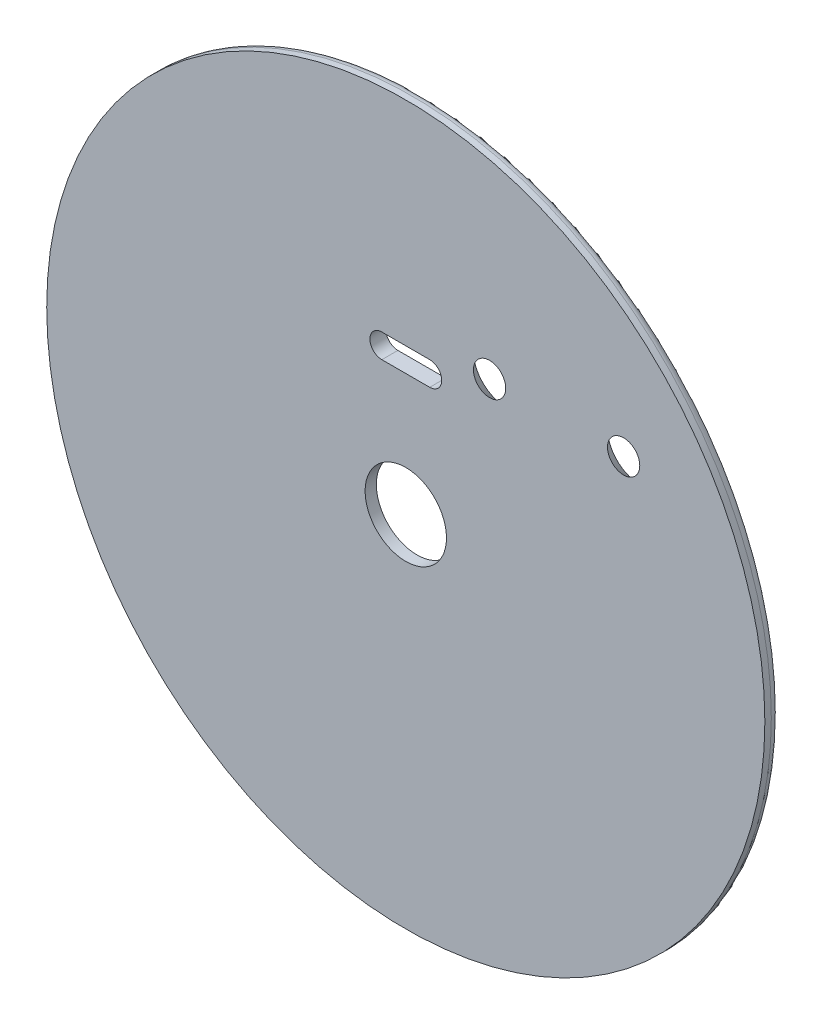
ISO-10303-21;
HEADER;
FILE_DESCRIPTION(('STEP AP214'),'2;1');
FILE_NAME('part.step','',(''),(''),'','','');
FILE_SCHEMA(('AUTOMOTIVE_DESIGN { 1 0 10303 214 1 1 1 1 }'));
ENDSEC;
DATA;
#1=APPLICATION_CONTEXT('core data for automotive mechanical design processes');
#2=APPLICATION_PROTOCOL_DEFINITION('international standard','automotive_design',2000,#1);
#3=PRODUCT_CONTEXT('',#1,'mechanical');
#4=PRODUCT('Part','Part','',(#3));
#5=PRODUCT_RELATED_PRODUCT_CATEGORY('part','',(#4));
#6=PRODUCT_DEFINITION_FORMATION('','',#4);
#7=PRODUCT_DEFINITION_CONTEXT('part definition',#1,'design');
#8=PRODUCT_DEFINITION('design','',#6,#7);
#9=PRODUCT_DEFINITION_SHAPE('','',#8);
#10=(LENGTH_UNIT() NAMED_UNIT(*) SI_UNIT(.MILLI.,.METRE.));
#11=(NAMED_UNIT(*) PLANE_ANGLE_UNIT() SI_UNIT($,.RADIAN.));
#12=(NAMED_UNIT(*) SI_UNIT($,.STERADIAN.) SOLID_ANGLE_UNIT());
#13=UNCERTAINTY_MEASURE_WITH_UNIT(LENGTH_MEASURE(1.E-05),#10,'distance_accuracy_value','');
#14=(GEOMETRIC_REPRESENTATION_CONTEXT(3) GLOBAL_UNCERTAINTY_ASSIGNED_CONTEXT((#13)) GLOBAL_UNIT_ASSIGNED_CONTEXT((#10,
#11,#12)) REPRESENTATION_CONTEXT('',''));
#15=CARTESIAN_POINT('',(0.,0.,0.));
#16=DIRECTION('',(0.,0.,1.));
#17=DIRECTION('',(1.,0.,0.));
#18=AXIS2_PLACEMENT_3D('',#15,#16,#17);
#19=CARTESIAN_POINT('',(0.,0.,3.35));
#20=DIRECTION('',(0.,0.,-1.));
#21=DIRECTION('',(-1.,0.,0.));
#22=AXIS2_PLACEMENT_3D('',#19,#20,#21);
#23=CYLINDRICAL_SURFACE('',#22,8.5);
#24=CARTESIAN_POINT('',(0.,0.,3.35));
#25=DIRECTION('',(0.,0.,1.));
#26=DIRECTION('',(1.,0.,0.));
#27=AXIS2_PLACEMENT_3D('',#24,#25,#26);
#28=CIRCLE('',#27,8.5);
#29=CARTESIAN_POINT('',(8.5,0.,3.35));
#30=VERTEX_POINT('',#29);
#31=EDGE_CURVE('E115',#30,#30,#28,.T.);
#32=ORIENTED_EDGE('',*,*,#31,.T.);
#33=EDGE_LOOP('',(#32));
#34=FACE_BOUND('',#33,.T.);
#35=CARTESIAN_POINT('',(0.,0.,1.));
#36=DIRECTION('',(0.,0.,-1.));
#37=DIRECTION('',(-1.,0.,0.));
#38=AXIS2_PLACEMENT_3D('',#35,#36,#37);
#39=CIRCLE('',#38,8.5);
#40=CARTESIAN_POINT('',(-8.5,0.,1.));
#41=VERTEX_POINT('',#40);
#42=EDGE_CURVE('E112',#41,#41,#39,.T.);
#43=ORIENTED_EDGE('',*,*,#42,.T.);
#44=EDGE_LOOP('',(#43));
#45=FACE_BOUND('',#44,.T.);
#46=ADVANCED_FACE('F32',(#34,#45),#23,.F.);
#47=CARTESIAN_POINT('',(0.,0.,3.35));
#48=DIRECTION('',(0.,0.,1.));
#49=DIRECTION('',(1.,0.,0.));
#50=AXIS2_PLACEMENT_3D('',#47,#48,#49);
#51=PLANE('',#50);
#52=CARTESIAN_POINT('',(45.5,33.25,3.35));
#53=DIRECTION('',(0.,0.,1.));
#54=DIRECTION('',(1.,0.,0.));
#55=AXIS2_PLACEMENT_3D('',#52,#53,#54);
#56=CIRCLE('',#55,3.37000000000001);
#57=CARTESIAN_POINT('',(48.87,33.25,3.35));
#58=VERTEX_POINT('',#57);
#59=EDGE_CURVE('E199',#58,#58,#56,.T.);
#60=ORIENTED_EDGE('',*,*,#59,.F.);
#61=EDGE_LOOP('',(#60));
#62=FACE_BOUND('',#61,.T.);
#63=CARTESIAN_POINT('',(17.5,33.25,3.35));
#64=DIRECTION('',(0.,0.,1.));
#65=DIRECTION('',(1.,0.,0.));
#66=AXIS2_PLACEMENT_3D('',#63,#64,#65);
#67=CIRCLE('',#66,3.37000000000001);
#68=CARTESIAN_POINT('',(20.87,33.25,3.35));
#69=VERTEX_POINT('',#68);
#70=EDGE_CURVE('E190',#69,#69,#67,.T.);
#71=ORIENTED_EDGE('',*,*,#70,.F.);
#72=EDGE_LOOP('',(#71));
#73=FACE_BOUND('',#72,.T.);
#74=CARTESIAN_POINT('',(5.,28.,3.35));
#75=DIRECTION('',(0.,0.,1.));
#76=DIRECTION('',(1.,0.,0.));
#77=AXIS2_PLACEMENT_3D('',#74,#75,#76);
#78=CIRCLE('',#77,2.5);
#79=CARTESIAN_POINT('',(5.,25.5,3.35));
#80=VERTEX_POINT('',#79);
#81=CARTESIAN_POINT('',(5.,30.5,3.35));
#82=VERTEX_POINT('',#81);
#83=EDGE_CURVE('E106',#80,#82,#78,.T.);
#84=ORIENTED_EDGE('',*,*,#83,.F.);
#85=DIRECTION('',(1.,0.,0.));
#86=VECTOR('',#85,1.);
#87=CARTESIAN_POINT('',(0.,25.5,3.35));
#88=LINE('',#87,#86);
#89=CARTESIAN_POINT('',(-5.,25.5,3.35));
#90=VERTEX_POINT('',#89);
#91=EDGE_CURVE('E99',#90,#80,#88,.T.);
#92=ORIENTED_EDGE('',*,*,#91,.F.);
#93=CARTESIAN_POINT('',(-5.,28.,3.35));
#94=DIRECTION('',(0.,0.,1.));
#95=DIRECTION('',(1.,0.,0.));
#96=AXIS2_PLACEMENT_3D('',#93,#94,#95);
#97=CIRCLE('',#96,2.5);
#98=CARTESIAN_POINT('',(-5.,30.5,3.35));
#99=VERTEX_POINT('',#98);
#100=EDGE_CURVE('E79',#99,#90,#97,.T.);
#101=ORIENTED_EDGE('',*,*,#100,.F.);
#102=DIRECTION('',(-1.,0.,0.));
#103=VECTOR('',#102,1.);
#104=CARTESIAN_POINT('',(0.,30.5,3.35));
#105=LINE('',#104,#103);
#106=EDGE_CURVE('E104',#82,#99,#105,.T.);
#107=ORIENTED_EDGE('',*,*,#106,.F.);
#108=EDGE_LOOP('',(#84,#92,#101,#107));
#109=FACE_BOUND('',#108,.T.);
#110=CARTESIAN_POINT('',(0.,0.,3.35));
#111=DIRECTION('',(0.,0.,1.));
#112=DIRECTION('',(1.,0.,0.));
#113=AXIS2_PLACEMENT_3D('',#110,#111,#112);
#114=CIRCLE('',#113,75.);
#115=CARTESIAN_POINT('',(75.,0.,3.35));
#116=VERTEX_POINT('',#115);
#117=EDGE_CURVE('E118',#116,#116,#114,.T.);
#118=ORIENTED_EDGE('',*,*,#117,.T.);
#119=EDGE_LOOP('',(#118));
#120=FACE_BOUND('',#119,.T.);
#121=ORIENTED_EDGE('',*,*,#31,.F.);
#122=EDGE_LOOP('',(#121));
#123=FACE_BOUND('',#122,.T.);
#124=ADVANCED_FACE('F139',(#62,#73,#109,#120,#123),#51,.T.);
#125=CARTESIAN_POINT('',(0.,0.,0.));
#126=DIRECTION('',(0.,0.,1.));
#127=DIRECTION('',(1.,0.,0.));
#128=AXIS2_PLACEMENT_3D('',#125,#126,#127);
#129=PLANE('',#128);
#130=CARTESIAN_POINT('',(0.,0.,0.));
#131=DIRECTION('',(0.,0.,1.));
#132=DIRECTION('',(1.,0.,0.));
#133=AXIS2_PLACEMENT_3D('',#130,#131,#132);
#134=CIRCLE('',#133,73.);
#135=CARTESIAN_POINT('',(73.,0.,0.));
#136=VERTEX_POINT('',#135);
#137=EDGE_CURVE('E11',#136,#136,#134,.F.);
#138=ORIENTED_EDGE('',*,*,#137,.T.);
#139=EDGE_LOOP('',(#138));
#140=FACE_BOUND('',#139,.T.);
#141=CARTESIAN_POINT('',(45.5,33.25,0.));
#142=DIRECTION('',(0.,0.,-1.));
#143=DIRECTION('',(-1.,0.,0.));
#144=AXIS2_PLACEMENT_3D('',#141,#142,#143);
#145=CIRCLE('',#144,6.72);
#146=CARTESIAN_POINT('',(38.78,33.25,0.));
#147=VERTEX_POINT('',#146);
#148=EDGE_CURVE('E195',#147,#147,#145,.T.);
#149=ORIENTED_EDGE('',*,*,#148,.F.);
#150=EDGE_LOOP('',(#149));
#151=FACE_BOUND('',#150,.T.);
#152=CARTESIAN_POINT('',(17.5,33.25,0.));
#153=DIRECTION('',(0.,0.,-1.));
#154=DIRECTION('',(-1.,0.,0.));
#155=AXIS2_PLACEMENT_3D('',#152,#153,#154);
#156=CIRCLE('',#155,6.72);
#157=CARTESIAN_POINT('',(10.78,33.25,0.));
#158=VERTEX_POINT('',#157);
#159=EDGE_CURVE('E193',#158,#158,#156,.T.);
#160=ORIENTED_EDGE('',*,*,#159,.F.);
#161=EDGE_LOOP('',(#160));
#162=FACE_BOUND('',#161,.T.);
#163=DIRECTION('',(-1.,0.,0.));
#164=VECTOR('',#163,1.);
#165=CARTESIAN_POINT('',(5.,25.5,0.));
#166=LINE('',#165,#164);
#167=CARTESIAN_POINT('',(5.,25.5,0.));
#168=VERTEX_POINT('',#167);
#169=CARTESIAN_POINT('',(-5.,25.5,0.));
#170=VERTEX_POINT('',#169);
#171=EDGE_CURVE('E85',#168,#170,#166,.T.);
#172=ORIENTED_EDGE('',*,*,#171,.F.);
#173=CARTESIAN_POINT('',(5.,28.,0.));
#174=DIRECTION('',(0.,0.,-1.));
#175=DIRECTION('',(1.,0.,0.));
#176=AXIS2_PLACEMENT_3D('',#173,#174,#175);
#177=CIRCLE('',#176,2.5);
#178=CARTESIAN_POINT('',(5.,30.5,0.));
#179=VERTEX_POINT('',#178);
#180=EDGE_CURVE('E55',#179,#168,#177,.T.);
#181=ORIENTED_EDGE('',*,*,#180,.F.);
#182=DIRECTION('',(1.,0.,0.));
#183=VECTOR('',#182,1.);
#184=CARTESIAN_POINT('',(5.,30.5,0.));
#185=LINE('',#184,#183);
#186=CARTESIAN_POINT('',(-5.,30.5,0.));
#187=VERTEX_POINT('',#186);
#188=EDGE_CURVE('E92',#187,#179,#185,.T.);
#189=ORIENTED_EDGE('',*,*,#188,.F.);
#190=CARTESIAN_POINT('',(-5.,28.,0.));
#191=DIRECTION('',(0.,0.,-1.));
#192=DIRECTION('',(-1.,0.,0.));
#193=AXIS2_PLACEMENT_3D('',#190,#191,#192);
#194=CIRCLE('',#193,2.5);
#195=EDGE_CURVE('E76',#170,#187,#194,.T.);
#196=ORIENTED_EDGE('',*,*,#195,.F.);
#197=EDGE_LOOP('',(#172,#181,#189,#196));
#198=FACE_BOUND('',#197,.T.);
#199=CARTESIAN_POINT('',(0.,0.,0.));
#200=DIRECTION('',(0.,0.,-1.));
#201=DIRECTION('',(-1.,0.,0.));
#202=AXIS2_PLACEMENT_3D('',#199,#200,#201);
#203=CIRCLE('',#202,24.25);
#204=CARTESIAN_POINT('',(-24.25,0.,0.));
#205=VERTEX_POINT('',#204);
#206=EDGE_CURVE('E108',#205,#205,#203,.T.);
#207=ORIENTED_EDGE('',*,*,#206,.F.);
#208=EDGE_LOOP('',(#207));
#209=FACE_BOUND('',#208,.T.);
#210=ADVANCED_FACE('F89',(#140,#151,#162,#198,#209),#129,.F.);
#211=CARTESIAN_POINT('',(0.,0.,3.35));
#212=DIRECTION('',(0.,0.,-1.));
#213=DIRECTION('',(-1.,0.,0.));
#214=AXIS2_PLACEMENT_3D('',#211,#212,#213);
#215=CYLINDRICAL_SURFACE('',#214,75.);
#216=CARTESIAN_POINT('',(0.,0.,2.));
#217=DIRECTION('',(0.,0.,1.));
#218=DIRECTION('',(1.,0.,0.));
#219=AXIS2_PLACEMENT_3D('',#216,#217,#218);
#220=CIRCLE('',#219,75.);
#221=CARTESIAN_POINT('',(75.,0.,2.));
#222=VERTEX_POINT('',#221);
#223=EDGE_CURVE('E40',#222,#222,#220,.T.);
#224=ORIENTED_EDGE('',*,*,#223,.T.);
#225=EDGE_LOOP('',(#224));
#226=FACE_BOUND('',#225,.T.);
#227=ORIENTED_EDGE('',*,*,#117,.F.);
#228=EDGE_LOOP('',(#227));
#229=FACE_BOUND('',#228,.T.);
#230=ADVANCED_FACE('F125',(#226,#229),#215,.T.);
#231=CARTESIAN_POINT('',(0.,0.,1.));
#232=DIRECTION('',(0.,0.,-1.));
#233=DIRECTION('',(-1.,0.,0.));
#234=AXIS2_PLACEMENT_3D('',#231,#232,#233);
#235=CYLINDRICAL_SURFACE('',#234,24.25);
#236=CARTESIAN_POINT('',(0.,0.,1.));
#237=DIRECTION('',(0.,0.,-1.));
#238=DIRECTION('',(-1.,0.,0.));
#239=AXIS2_PLACEMENT_3D('',#236,#237,#238);
#240=CIRCLE('',#239,24.25);
#241=CARTESIAN_POINT('',(-24.25,0.,1.));
#242=VERTEX_POINT('',#241);
#243=EDGE_CURVE('E109',#242,#242,#240,.T.);
#244=ORIENTED_EDGE('',*,*,#243,.F.);
#245=EDGE_LOOP('',(#244));
#246=FACE_BOUND('',#245,.T.);
#247=ORIENTED_EDGE('',*,*,#206,.T.);
#248=EDGE_LOOP('',(#247));
#249=FACE_BOUND('',#248,.T.);
#250=ADVANCED_FACE('F149',(#246,#249),#235,.F.);
#251=CARTESIAN_POINT('',(0.,0.,1.));
#252=DIRECTION('',(0.,0.,-1.));
#253=DIRECTION('',(-1.,0.,0.));
#254=AXIS2_PLACEMENT_3D('',#251,#252,#253);
#255=PLANE('',#254);
#256=ORIENTED_EDGE('',*,*,#42,.F.);
#257=EDGE_LOOP('',(#256));
#258=FACE_BOUND('',#257,.T.);
#259=ORIENTED_EDGE('',*,*,#243,.T.);
#260=EDGE_LOOP('',(#259));
#261=FACE_BOUND('',#260,.T.);
#262=ADVANCED_FACE('F158',(#258,#261),#255,.T.);
#263=CARTESIAN_POINT('',(5.,28.,10.));
#264=DIRECTION('',(0.,0.,-1.));
#265=DIRECTION('',(-1.,0.,0.));
#266=AXIS2_PLACEMENT_3D('',#263,#264,#265);
#267=CYLINDRICAL_SURFACE('',#266,2.5);
#268=ORIENTED_EDGE('',*,*,#83,.T.);
#269=DIRECTION('',(0.,0.,-1.));
#270=VECTOR('',#269,1.);
#271=CARTESIAN_POINT('',(5.,30.5,10.));
#272=LINE('',#271,#270);
#273=EDGE_CURVE('E97',#82,#179,#272,.T.);
#274=ORIENTED_EDGE('',*,*,#273,.T.);
#275=ORIENTED_EDGE('',*,*,#180,.T.);
#276=DIRECTION('',(0.,0.,-1.));
#277=VECTOR('',#276,1.);
#278=CARTESIAN_POINT('',(5.,25.5,10.));
#279=LINE('',#278,#277);
#280=EDGE_CURVE('E82',#80,#168,#279,.T.);
#281=ORIENTED_EDGE('',*,*,#280,.F.);
#282=EDGE_LOOP('',(#268,#274,#275,#281));
#283=FACE_BOUND('',#282,.T.);
#284=ADVANCED_FACE('F163',(#283),#267,.F.);
#285=CARTESIAN_POINT('',(5.,30.5,10.));
#286=DIRECTION('',(0.,1.,0.));
#287=DIRECTION('',(0.,0.,1.));
#288=AXIS2_PLACEMENT_3D('',#285,#286,#287);
#289=PLANE('',#288);
#290=ORIENTED_EDGE('',*,*,#106,.T.);
#291=DIRECTION('',(0.,0.,-1.));
#292=VECTOR('',#291,1.);
#293=CARTESIAN_POINT('',(-5.,30.5,10.));
#294=LINE('',#293,#292);
#295=EDGE_CURVE('E81',#99,#187,#294,.T.);
#296=ORIENTED_EDGE('',*,*,#295,.T.);
#297=ORIENTED_EDGE('',*,*,#188,.T.);
#298=ORIENTED_EDGE('',*,*,#273,.F.);
#299=EDGE_LOOP('',(#290,#296,#297,#298));
#300=FACE_BOUND('',#299,.T.);
#301=ADVANCED_FACE('F172',(#300),#289,.F.);
#302=CARTESIAN_POINT('',(-5.,28.,10.));
#303=DIRECTION('',(0.,0.,-1.));
#304=DIRECTION('',(-1.,0.,0.));
#305=AXIS2_PLACEMENT_3D('',#302,#303,#304);
#306=CYLINDRICAL_SURFACE('',#305,2.5);
#307=ORIENTED_EDGE('',*,*,#100,.T.);
#308=DIRECTION('',(0.,0.,-1.));
#309=VECTOR('',#308,1.);
#310=CARTESIAN_POINT('',(-5.,25.5,10.));
#311=LINE('',#310,#309);
#312=EDGE_CURVE('E47',#90,#170,#311,.T.);
#313=ORIENTED_EDGE('',*,*,#312,.T.);
#314=ORIENTED_EDGE('',*,*,#195,.T.);
#315=ORIENTED_EDGE('',*,*,#295,.F.);
#316=EDGE_LOOP('',(#307,#313,#314,#315));
#317=FACE_BOUND('',#316,.T.);
#318=ADVANCED_FACE('F73',(#317),#306,.F.);
#319=CARTESIAN_POINT('',(5.,25.5,10.));
#320=DIRECTION('',(0.,-1.,0.));
#321=DIRECTION('',(0.,0.,-1.));
#322=AXIS2_PLACEMENT_3D('',#319,#320,#321);
#323=PLANE('',#322);
#324=ORIENTED_EDGE('',*,*,#91,.T.);
#325=ORIENTED_EDGE('',*,*,#280,.T.);
#326=ORIENTED_EDGE('',*,*,#171,.T.);
#327=ORIENTED_EDGE('',*,*,#312,.F.);
#328=EDGE_LOOP('',(#324,#325,#326,#327));
#329=FACE_BOUND('',#328,.T.);
#330=ADVANCED_FACE('F86',(#329),#323,.F.);
#331=CARTESIAN_POINT('',(17.5,33.25,0.));
#332=DIRECTION('',(0.,0.,-1.));
#333=DIRECTION('',(-1.,0.,0.));
#334=AXIS2_PLACEMENT_3D('',#331,#332,#333);
#335=CONICAL_SURFACE('',#334,6.72,0.785398163397447);
#336=ORIENTED_EDGE('',*,*,#70,.T.);
#337=EDGE_LOOP('',(#336));
#338=FACE_BOUND('',#337,.T.);
#339=ORIENTED_EDGE('',*,*,#159,.T.);
#340=EDGE_LOOP('',(#339));
#341=FACE_BOUND('',#340,.T.);
#342=ADVANCED_FACE('F134',(#338,#341),#335,.F.);
#343=CARTESIAN_POINT('',(45.5,33.25,0.));
#344=DIRECTION('',(0.,0.,-1.));
#345=DIRECTION('',(-1.,0.,0.));
#346=AXIS2_PLACEMENT_3D('',#343,#344,#345);
#347=CONICAL_SURFACE('',#346,6.72,0.785398163397447);
#348=ORIENTED_EDGE('',*,*,#59,.T.);
#349=EDGE_LOOP('',(#348));
#350=FACE_BOUND('',#349,.T.);
#351=ORIENTED_EDGE('',*,*,#148,.T.);
#352=EDGE_LOOP('',(#351));
#353=FACE_BOUND('',#352,.T.);
#354=ADVANCED_FACE('F129',(#350,#353),#347,.F.);
#355=CARTESIAN_POINT('',(0.,0.,2.));
#356=DIRECTION('',(0.,0.,1.));
#357=DIRECTION('',(1.,0.,0.));
#358=AXIS2_PLACEMENT_3D('',#355,#356,#357);
#359=TOROIDAL_SURFACE('',#358,73.,2.);
#360=ORIENTED_EDGE('',*,*,#137,.F.);
#361=EDGE_LOOP('',(#360));
#362=FACE_BOUND('',#361,.T.);
#363=ORIENTED_EDGE('',*,*,#223,.F.);
#364=EDGE_LOOP('',(#363));
#365=FACE_BOUND('',#364,.T.);
#366=ADVANCED_FACE('F34',(#362,#365),#359,.T.);
#367=CLOSED_SHELL('',(#46,#124,#210,#230,#250,#262,#284,#301,#318,#330,#342,#354,#366));
#368=MANIFOLD_SOLID_BREP('B2',#367);
#369=ADVANCED_BREP_SHAPE_REPRESENTATION('',(#18,#368),#14);
#370=SHAPE_DEFINITION_REPRESENTATION(#9,#369);
ENDSEC;
END-ISO-10303-21;
